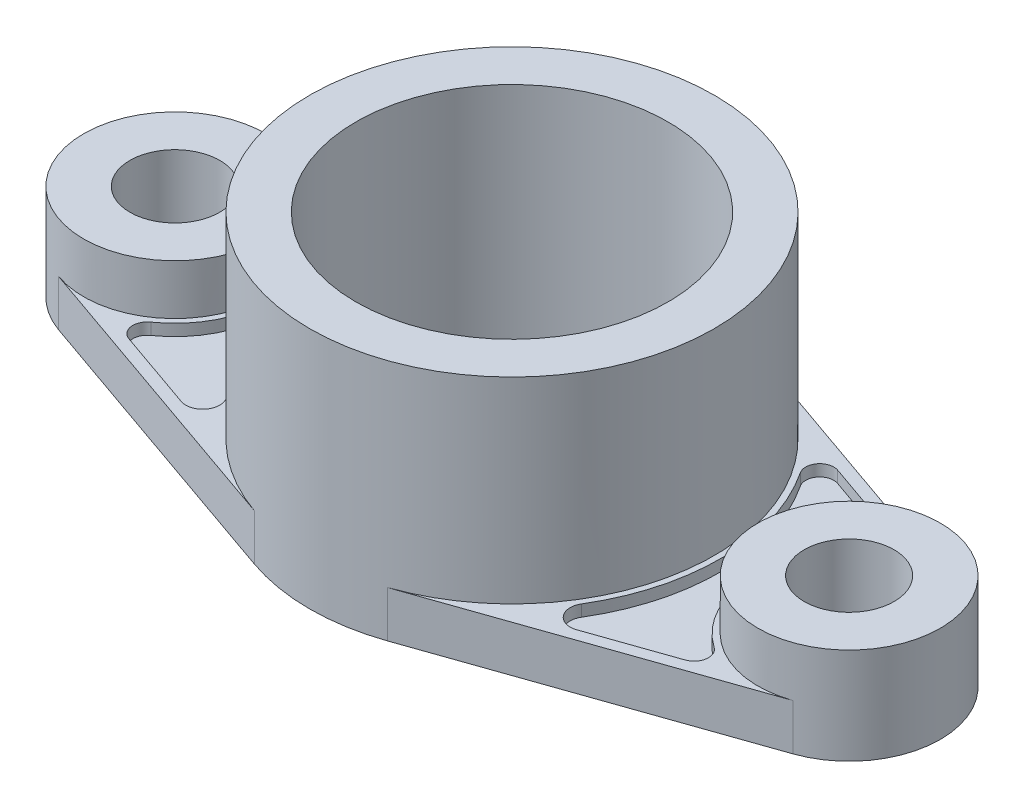
ISO-10303-21;
HEADER;
FILE_DESCRIPTION(('STEP AP214'),'2;1');
FILE_NAME('part.step','',(''),(''),'','','');
FILE_SCHEMA(('AUTOMOTIVE_DESIGN { 1 0 10303 214 1 1 1 1 }'));
ENDSEC;
DATA;
#1=APPLICATION_CONTEXT('core data for automotive mechanical design processes');
#2=APPLICATION_PROTOCOL_DEFINITION('international standard','automotive_design',2000,#1);
#3=PRODUCT_CONTEXT('',#1,'mechanical');
#4=PRODUCT('Part','Part','',(#3));
#5=PRODUCT_RELATED_PRODUCT_CATEGORY('part','',(#4));
#6=PRODUCT_DEFINITION_FORMATION('','',#4);
#7=PRODUCT_DEFINITION_CONTEXT('part definition',#1,'design');
#8=PRODUCT_DEFINITION('design','',#6,#7);
#9=PRODUCT_DEFINITION_SHAPE('','',#8);
#10=(LENGTH_UNIT() NAMED_UNIT(*) SI_UNIT(.MILLI.,.METRE.));
#11=(NAMED_UNIT(*) PLANE_ANGLE_UNIT() SI_UNIT($,.RADIAN.));
#12=(NAMED_UNIT(*) SI_UNIT($,.STERADIAN.) SOLID_ANGLE_UNIT());
#13=UNCERTAINTY_MEASURE_WITH_UNIT(LENGTH_MEASURE(1.E-05),#10,'distance_accuracy_value','');
#14=(GEOMETRIC_REPRESENTATION_CONTEXT(3) GLOBAL_UNCERTAINTY_ASSIGNED_CONTEXT((#13)) GLOBAL_UNIT_ASSIGNED_CONTEXT((#10,
#11,#12)) REPRESENTATION_CONTEXT('',''));
#15=CARTESIAN_POINT('',(0.,0.,0.));
#16=DIRECTION('',(0.,0.,1.));
#17=DIRECTION('',(1.,0.,0.));
#18=AXIS2_PLACEMENT_3D('',#15,#16,#17);
#19=CARTESIAN_POINT('',(0.,63.,0.));
#20=DIRECTION('',(0.,-1.,0.));
#21=DIRECTION('',(0.,0.,-1.));
#22=AXIS2_PLACEMENT_3D('',#19,#20,#21);
#23=CYLINDRICAL_SURFACE('',#22,52.5);
#24=CARTESIAN_POINT('',(0.,63.,0.));
#25=DIRECTION('',(0.,1.,0.));
#26=DIRECTION('',(0.,0.,1.));
#27=AXIS2_PLACEMENT_3D('',#24,#25,#26);
#28=CIRCLE('',#27,52.5);
#29=CARTESIAN_POINT('',(0.,63.,52.5));
#30=VERTEX_POINT('',#29);
#31=EDGE_CURVE('E275',#30,#30,#28,.T.);
#32=ORIENTED_EDGE('',*,*,#31,.F.);
#33=EDGE_LOOP('',(#32));
#34=FACE_BOUND('',#33,.T.);
#35=DIRECTION('',(0.,-1.,0.));
#36=VECTOR('',#35,1.);
#37=CARTESIAN_POINT('',(-17.301,12.,-49.56738241021));
#38=LINE('',#37,#36);
#39=CARTESIAN_POINT('',(-17.301,12.,-49.56738241021));
#40=VERTEX_POINT('',#39);
#41=CARTESIAN_POINT('',(-17.301,0.,-49.56738241021));
#42=VERTEX_POINT('',#41);
#43=EDGE_CURVE('E213',#40,#42,#38,.T.);
#44=ORIENTED_EDGE('',*,*,#43,.F.);
#45=CARTESIAN_POINT('',(0.,12.,0.));
#46=DIRECTION('',(0.,1.,0.));
#47=DIRECTION('',(0.,0.,1.));
#48=AXIS2_PLACEMENT_3D('',#45,#46,#47);
#49=CIRCLE('',#48,52.5);
#50=CARTESIAN_POINT('',(-17.301,12.,49.56738241021));
#51=VERTEX_POINT('',#50);
#52=EDGE_CURVE('E218',#40,#51,#49,.T.);
#53=ORIENTED_EDGE('',*,*,#52,.T.);
#54=DIRECTION('',(0.,-1.,0.));
#55=VECTOR('',#54,1.);
#56=CARTESIAN_POINT('',(-17.301,12.,49.56738241021));
#57=LINE('',#56,#55);
#58=CARTESIAN_POINT('',(-17.301,0.,49.56738241021));
#59=VERTEX_POINT('',#58);
#60=EDGE_CURVE('E241',#51,#59,#57,.T.);
#61=ORIENTED_EDGE('',*,*,#60,.T.);
#62=CARTESIAN_POINT('',(0.,0.,0.));
#63=DIRECTION('',(0.,1.,0.));
#64=DIRECTION('',(0.,0.,1.));
#65=AXIS2_PLACEMENT_3D('',#62,#63,#64);
#66=CIRCLE('',#65,52.5);
#67=CARTESIAN_POINT('',(17.301,0.,49.56738241021));
#68=VERTEX_POINT('',#67);
#69=EDGE_CURVE('E276',#59,#68,#66,.T.);
#70=ORIENTED_EDGE('',*,*,#69,.T.);
#71=DIRECTION('',(0.,-1.,0.));
#72=VECTOR('',#71,1.);
#73=CARTESIAN_POINT('',(17.301,12.,49.56738241021));
#74=LINE('',#73,#72);
#75=CARTESIAN_POINT('',(17.301,12.,49.56738241021));
#76=VERTEX_POINT('',#75);
#77=EDGE_CURVE('E340',#76,#68,#74,.T.);
#78=ORIENTED_EDGE('',*,*,#77,.F.);
#79=CARTESIAN_POINT('',(0.,12.,0.));
#80=DIRECTION('',(0.,1.,0.));
#81=DIRECTION('',(0.,0.,1.));
#82=AXIS2_PLACEMENT_3D('',#79,#80,#81);
#83=CIRCLE('',#82,52.5);
#84=CARTESIAN_POINT('',(17.301,12.,-49.5673824102101));
#85=VERTEX_POINT('',#84);
#86=EDGE_CURVE('E329',#76,#85,#83,.T.);
#87=ORIENTED_EDGE('',*,*,#86,.T.);
#88=DIRECTION('',(0.,-1.,0.));
#89=VECTOR('',#88,1.);
#90=CARTESIAN_POINT('',(17.301,12.,-49.56738241021));
#91=LINE('',#90,#89);
#92=CARTESIAN_POINT('',(17.301,0.,-49.56738241021));
#93=VERTEX_POINT('',#92);
#94=EDGE_CURVE('E341',#85,#93,#91,.T.);
#95=ORIENTED_EDGE('',*,*,#94,.T.);
#96=EDGE_CURVE('E272',#93,#42,#66,.T.);
#97=ORIENTED_EDGE('',*,*,#96,.T.);
#98=EDGE_LOOP('',(#44,#53,#61,#70,#78,#87,#95,#97));
#99=FACE_BOUND('',#98,.T.);
#100=ADVANCED_FACE('F41',(#34,#99),#23,.T.);
#101=CARTESIAN_POINT('',(17.301,12.,49.56738241021));
#102=DIRECTION('',(-0.329542857142857,0.,-0.944140617337334));
#103=DIRECTION('',(-0.944140617337334,0.,0.329542857142857));
#104=AXIS2_PLACEMENT_3D('',#101,#102,#103);
#105=PLANE('',#104);
#106=DIRECTION('',(0.944140617337334,0.,-0.329542857142857));
#107=VECTOR('',#106,1.);
#108=CARTESIAN_POINT('',(17.301,0.,49.56738241021));
#109=LINE('',#108,#107);
#110=CARTESIAN_POINT('',(95.2986317142857,0.,22.343087709288));
#111=VERTEX_POINT('',#110);
#112=EDGE_CURVE('E298',#68,#111,#109,.T.);
#113=ORIENTED_EDGE('',*,*,#112,.T.);
#114=DIRECTION('',(0.,-1.,0.));
#115=VECTOR('',#114,1.);
#116=CARTESIAN_POINT('',(95.2986317142857,12.,22.343087709288));
#117=LINE('',#116,#115);
#118=CARTESIAN_POINT('',(95.2986317142857,12.,22.343087709288));
#119=VERTEX_POINT('',#118);
#120=EDGE_CURVE('E11',#119,#111,#117,.T.);
#121=ORIENTED_EDGE('',*,*,#120,.F.);
#122=DIRECTION('',(0.944140617337334,0.,-0.329542857142857));
#123=VECTOR('',#122,1.);
#124=CARTESIAN_POINT('',(17.301,12.,49.56738241021));
#125=LINE('',#124,#123);
#126=EDGE_CURVE('E321',#76,#119,#125,.T.);
#127=ORIENTED_EDGE('',*,*,#126,.F.);
#128=ORIENTED_EDGE('',*,*,#77,.T.);
#129=EDGE_LOOP('',(#113,#121,#127,#128));
#130=FACE_BOUND('',#129,.T.);
#131=ADVANCED_FACE('F406',(#130),#105,.F.);
#132=CARTESIAN_POINT('',(17.301,12.,-49.56738241021));
#133=DIRECTION('',(0.329542857142857,0.,-0.944140617337334));
#134=DIRECTION('',(-0.944140617337334,0.,-0.329542857142857));
#135=AXIS2_PLACEMENT_3D('',#132,#133,#134);
#136=PLANE('',#135);
#137=DIRECTION('',(0.944140617337334,0.,0.329542857142858));
#138=VECTOR('',#137,1.);
#139=CARTESIAN_POINT('',(17.301,0.,-49.56738241021));
#140=LINE('',#139,#138);
#141=CARTESIAN_POINT('',(95.2986317142857,0.,-22.343087709288));
#142=VERTEX_POINT('',#141);
#143=EDGE_CURVE('E303',#93,#142,#140,.T.);
#144=ORIENTED_EDGE('',*,*,#143,.F.);
#145=ORIENTED_EDGE('',*,*,#94,.F.);
#146=DIRECTION('',(0.944140617337334,0.,0.329542857142858));
#147=VECTOR('',#146,1.);
#148=CARTESIAN_POINT('',(17.301,12.,-49.56738241021));
#149=LINE('',#148,#147);
#150=CARTESIAN_POINT('',(95.2986317142857,12.,-22.343087709288));
#151=VERTEX_POINT('',#150);
#152=EDGE_CURVE('E330',#85,#151,#149,.T.);
#153=ORIENTED_EDGE('',*,*,#152,.T.);
#154=DIRECTION('',(0.,-1.,0.));
#155=VECTOR('',#154,1.);
#156=CARTESIAN_POINT('',(95.2986317142857,12.,-22.343087709288));
#157=LINE('',#156,#155);
#158=EDGE_CURVE('E49',#151,#142,#157,.T.);
#159=ORIENTED_EDGE('',*,*,#158,.T.);
#160=EDGE_LOOP('',(#144,#145,#153,#159));
#161=FACE_BOUND('',#160,.T.);
#162=ADVANCED_FACE('F414',(#161),#136,.T.);
#163=CARTESIAN_POINT('',(0.,12.,0.));
#164=DIRECTION('',(0.,-1.,0.));
#165=DIRECTION('',(0.,0.,-1.));
#166=AXIS2_PLACEMENT_3D('',#163,#164,#165);
#167=CYLINDRICAL_SURFACE('',#166,54.);
#168=CARTESIAN_POINT('',(0.,9.,0.));
#169=DIRECTION('',(0.,1.,0.));
#170=DIRECTION('',(0.,0.,1.));
#171=AXIS2_PLACEMENT_3D('',#168,#169,#170);
#172=CIRCLE('',#171,54.);
#173=CARTESIAN_POINT('',(45.0507159156692,9.,-29.7730246277679));
#174=VERTEX_POINT('',#173);
#175=CARTESIAN_POINT('',(46.1221029185628,9.,28.0847222234706));
#176=VERTEX_POINT('',#175);
#177=EDGE_CURVE('E66',#174,#176,#172,.F.);
#178=ORIENTED_EDGE('',*,*,#177,.F.);
#179=DIRECTION('',(0.,-1.,0.));
#180=VECTOR('',#179,1.);
#181=CARTESIAN_POINT('',(45.0507159156692,12.,-29.7730246277679));
#182=LINE('',#181,#180);
#183=CARTESIAN_POINT('',(45.0507159156692,12.,-29.7730246277679));
#184=VERTEX_POINT('',#183);
#185=EDGE_CURVE('E44',#184,#174,#182,.T.);
#186=ORIENTED_EDGE('',*,*,#185,.F.);
#187=CARTESIAN_POINT('',(0.,12.,0.));
#188=DIRECTION('',(0.,1.,0.));
#189=DIRECTION('',(0.,0.,1.));
#190=AXIS2_PLACEMENT_3D('',#187,#188,#189);
#191=CIRCLE('',#190,54.);
#192=CARTESIAN_POINT('',(46.1221029185628,12.,28.0847222234706));
#193=VERTEX_POINT('',#192);
#194=EDGE_CURVE('E297',#184,#193,#191,.F.);
#195=ORIENTED_EDGE('',*,*,#194,.T.);
#196=DIRECTION('',(0.,-1.,0.));
#197=VECTOR('',#196,1.);
#198=CARTESIAN_POINT('',(46.1221029185628,12.,28.0847222234706));
#199=LINE('',#198,#197);
#200=EDGE_CURVE('E334',#193,#176,#199,.T.);
#201=ORIENTED_EDGE('',*,*,#200,.T.);
#202=EDGE_LOOP('',(#178,#186,#195,#201));
#203=FACE_BOUND('',#202,.T.);
#204=ADVANCED_FACE('F43',(#203),#167,.T.);
#205=CARTESIAN_POINT('',(48.0913614824408,12.,-31.7825202263121));
#206=DIRECTION('',(0.,-1.,0.));
#207=DIRECTION('',(0.,0.,-1.));
#208=AXIS2_PLACEMENT_3D('',#205,#206,#207);
#209=CYLINDRICAL_SURFACE('',#208,3.6446670661799);
#210=CARTESIAN_POINT('',(48.0913614824408,9.,-31.7825202263121));
#211=DIRECTION('',(0.,1.,0.));
#212=DIRECTION('',(0.,0.,1.));
#213=AXIS2_PLACEMENT_3D('',#210,#211,#212);
#214=CIRCLE('',#213,3.6446670661799);
#215=CARTESIAN_POINT('',(49.2924354807642,9.,-35.2235984401642));
#216=VERTEX_POINT('',#215);
#217=EDGE_CURVE('E277',#216,#174,#214,.T.);
#218=ORIENTED_EDGE('',*,*,#217,.F.);
#219=DIRECTION('',(0.,-1.,0.));
#220=VECTOR('',#219,1.);
#221=CARTESIAN_POINT('',(49.2924354807642,12.,-35.2235984401642));
#222=LINE('',#221,#220);
#223=CARTESIAN_POINT('',(49.2924354807642,12.,-35.2235984401642));
#224=VERTEX_POINT('',#223);
#225=EDGE_CURVE('E362',#224,#216,#222,.T.);
#226=ORIENTED_EDGE('',*,*,#225,.F.);
#227=CARTESIAN_POINT('',(48.0913614824408,12.,-31.7825202263121));
#228=DIRECTION('',(0.,1.,0.));
#229=DIRECTION('',(0.,0.,1.));
#230=AXIS2_PLACEMENT_3D('',#227,#228,#229);
#231=CIRCLE('',#230,3.6446670661799);
#232=EDGE_CURVE('E302',#224,#184,#231,.T.);
#233=ORIENTED_EDGE('',*,*,#232,.T.);
#234=ORIENTED_EDGE('',*,*,#185,.T.);
#235=EDGE_LOOP('',(#218,#226,#233,#234));
#236=FACE_BOUND('',#235,.T.);
#237=ADVANCED_FACE('F369',(#236),#209,.F.);
#238=CARTESIAN_POINT('',(16.3123714285715,12.,-46.734960558198));
#239=DIRECTION('',(0.329542857142858,0.,-0.944140617337334));
#240=DIRECTION('',(-0.944140617337334,0.,-0.329542857142858));
#241=AXIS2_PLACEMENT_3D('',#238,#239,#240);
#242=PLANE('',#241);
#243=ORIENTED_EDGE('',*,*,#225,.T.);
#244=DIRECTION('',(0.944140617337334,0.,0.329542857142858));
#245=VECTOR('',#244,1.);
#246=CARTESIAN_POINT('',(16.3123714285715,9.,-46.734960558198));
#247=LINE('',#246,#245);
#248=CARTESIAN_POINT('',(73.0615652441253,9.,-26.9272209830564));
#249=VERTEX_POINT('',#248);
#250=EDGE_CURVE('E299',#216,#249,#247,.T.);
#251=ORIENTED_EDGE('',*,*,#250,.T.);
#252=DIRECTION('',(0.,-1.,0.));
#253=VECTOR('',#252,1.);
#254=CARTESIAN_POINT('',(73.0615652441253,12.,-26.9272209830564));
#255=LINE('',#254,#253);
#256=CARTESIAN_POINT('',(73.0615652441253,12.,-26.9272209830564));
#257=VERTEX_POINT('',#256);
#258=EDGE_CURVE('E359',#257,#249,#255,.T.);
#259=ORIENTED_EDGE('',*,*,#258,.F.);
#260=DIRECTION('',(0.944140617337334,0.,0.329542857142858));
#261=VECTOR('',#260,1.);
#262=CARTESIAN_POINT('',(16.3123714285715,12.,-46.734960558198));
#263=LINE('',#262,#261);
#264=EDGE_CURVE('E307',#224,#257,#263,.T.);
#265=ORIENTED_EDGE('',*,*,#264,.F.);
#266=EDGE_LOOP('',(#243,#251,#259,#265));
#267=FACE_BOUND('',#266,.T.);
#268=ADVANCED_FACE('F397',(#267),#242,.F.);
#269=CARTESIAN_POINT('',(71.9820251135155,12.,-23.8343374225046));
#270=DIRECTION('',(0.,-1.,0.));
#271=DIRECTION('',(0.,0.,-1.));
#272=AXIS2_PLACEMENT_3D('',#269,#270,#271);
#273=CYLINDRICAL_SURFACE('',#272,3.27587173325332);
#274=ORIENTED_EDGE('',*,*,#258,.T.);
#275=CARTESIAN_POINT('',(71.9820251135155,9.,-23.8343374225046));
#276=DIRECTION('',(0.,1.,0.));
#277=DIRECTION('',(0.,0.,1.));
#278=AXIS2_PLACEMENT_3D('',#275,#276,#277);
#279=CIRCLE('',#278,3.27587173325332);
#280=CARTESIAN_POINT('',(73.7694139026057,9.,-21.0890547541146));
#281=VERTEX_POINT('',#280);
#282=EDGE_CURVE('E291',#249,#281,#279,.F.);
#283=ORIENTED_EDGE('',*,*,#282,.T.);
#284=DIRECTION('',(0.,-1.,0.));
#285=VECTOR('',#284,1.);
#286=CARTESIAN_POINT('',(73.7694139026057,12.,-21.0890547541146));
#287=LINE('',#286,#285);
#288=CARTESIAN_POINT('',(73.7694139026057,12.,-21.0890547541146));
#289=VERTEX_POINT('',#288);
#290=EDGE_CURVE('E360',#289,#281,#287,.T.);
#291=ORIENTED_EDGE('',*,*,#290,.F.);
#292=CARTESIAN_POINT('',(71.9820251135155,12.,-23.8343374225046));
#293=DIRECTION('',(0.,1.,0.));
#294=DIRECTION('',(0.,0.,1.));
#295=AXIS2_PLACEMENT_3D('',#292,#293,#294);
#296=CIRCLE('',#295,3.27587173325332);
#297=EDGE_CURVE('E310',#257,#289,#296,.F.);
#298=ORIENTED_EDGE('',*,*,#297,.F.);
#299=EDGE_LOOP('',(#274,#283,#291,#298));
#300=FACE_BOUND('',#299,.T.);
#301=ADVANCED_FACE('F396',(#300),#273,.F.);
#302=CARTESIAN_POINT('',(87.5,12.,0.));
#303=DIRECTION('',(0.,-1.,0.));
#304=DIRECTION('',(0.,0.,-1.));
#305=AXIS2_PLACEMENT_3D('',#302,#303,#304);
#306=CYLINDRICAL_SURFACE('',#305,25.165);
#307=CARTESIAN_POINT('',(87.5,9.,0.));
#308=DIRECTION('',(0.,1.,0.));
#309=DIRECTION('',(0.,0.,1.));
#310=AXIS2_PLACEMENT_3D('',#307,#308,#309);
#311=CIRCLE('',#310,25.165);
#312=CARTESIAN_POINT('',(73.1027290750617,9.,20.6396660562599));
#313=VERTEX_POINT('',#312);
#314=EDGE_CURVE('E292',#313,#281,#311,.F.);
#315=ORIENTED_EDGE('',*,*,#314,.F.);
#316=DIRECTION('',(0.,-1.,0.));
#317=VECTOR('',#316,1.);
#318=CARTESIAN_POINT('',(73.1027290750617,12.,20.6396660562599));
#319=LINE('',#318,#317);
#320=CARTESIAN_POINT('',(73.1027290750617,12.,20.6396660562599));
#321=VERTEX_POINT('',#320);
#322=EDGE_CURVE('E353',#321,#313,#319,.T.);
#323=ORIENTED_EDGE('',*,*,#322,.F.);
#324=CARTESIAN_POINT('',(87.5,12.,0.));
#325=DIRECTION('',(0.,1.,0.));
#326=DIRECTION('',(0.,0.,1.));
#327=AXIS2_PLACEMENT_3D('',#324,#325,#326);
#328=CIRCLE('',#327,25.165);
#329=EDGE_CURVE('E313',#321,#289,#328,.F.);
#330=ORIENTED_EDGE('',*,*,#329,.T.);
#331=ORIENTED_EDGE('',*,*,#290,.T.);
#332=EDGE_LOOP('',(#315,#323,#330,#331));
#333=FACE_BOUND('',#332,.T.);
#334=ADVANCED_FACE('F394',(#333),#306,.T.);
#335=CARTESIAN_POINT('',(70.9659800044808,12.,23.7028707075262));
#336=DIRECTION('',(0.,-1.,0.));
#337=DIRECTION('',(0.,0.,-1.));
#338=AXIS2_PLACEMENT_3D('',#335,#336,#337);
#339=CYLINDRICAL_SURFACE('',#338,3.73482520690969);
#340=CARTESIAN_POINT('',(70.9659800044808,9.,23.7028707075262));
#341=DIRECTION('',(0.,1.,0.));
#342=DIRECTION('',(0.,0.,1.));
#343=AXIS2_PLACEMENT_3D('',#340,#341,#342);
#344=CIRCLE('',#343,3.73482520690969);
#345=CARTESIAN_POINT('',(72.196764974095,9.,27.229070884025));
#346=VERTEX_POINT('',#345);
#347=EDGE_CURVE('E288',#346,#313,#344,.T.);
#348=ORIENTED_EDGE('',*,*,#347,.F.);
#349=DIRECTION('',(0.,-1.,0.));
#350=VECTOR('',#349,1.);
#351=CARTESIAN_POINT('',(72.196764974095,12.,27.229070884025));
#352=LINE('',#351,#350);
#353=CARTESIAN_POINT('',(72.196764974095,12.,27.229070884025));
#354=VERTEX_POINT('',#353);
#355=EDGE_CURVE('E354',#354,#346,#352,.T.);
#356=ORIENTED_EDGE('',*,*,#355,.F.);
#357=CARTESIAN_POINT('',(70.9659800044808,12.,23.7028707075262));
#358=DIRECTION('',(0.,1.,0.));
#359=DIRECTION('',(0.,0.,1.));
#360=AXIS2_PLACEMENT_3D('',#357,#358,#359);
#361=CIRCLE('',#360,3.73482520690969);
#362=EDGE_CURVE('E314',#354,#321,#361,.T.);
#363=ORIENTED_EDGE('',*,*,#362,.T.);
#364=ORIENTED_EDGE('',*,*,#322,.T.);
#365=EDGE_LOOP('',(#348,#356,#363,#364));
#366=FACE_BOUND('',#365,.T.);
#367=ADVANCED_FACE('F389',(#366),#339,.F.);
#368=CARTESIAN_POINT('',(16.3123714285714,12.,46.734960558198));
#369=DIRECTION('',(0.329542857142857,0.,0.944140617337334));
#370=DIRECTION('',(0.944140617337334,0.,-0.329542857142857));
#371=AXIS2_PLACEMENT_3D('',#368,#369,#370);
#372=PLANE('',#371);
#373=ORIENTED_EDGE('',*,*,#355,.T.);
#374=DIRECTION('',(-0.944140617337334,0.,0.329542857142857));
#375=VECTOR('',#374,1.);
#376=CARTESIAN_POINT('',(16.3123714285714,9.,46.734960558198));
#377=LINE('',#376,#375);
#378=CARTESIAN_POINT('',(51.3207411159862,9.,34.5156386067285));
#379=VERTEX_POINT('',#378);
#380=EDGE_CURVE('E286',#346,#379,#377,.T.);
#381=ORIENTED_EDGE('',*,*,#380,.T.);
#382=DIRECTION('',(0.,-1.,0.));
#383=VECTOR('',#382,1.);
#384=CARTESIAN_POINT('',(51.3207411159862,12.,34.5156386067285));
#385=LINE('',#384,#383);
#386=CARTESIAN_POINT('',(51.3207411159862,12.,34.5156386067285));
#387=VERTEX_POINT('',#386);
#388=EDGE_CURVE('E346',#387,#379,#385,.T.);
#389=ORIENTED_EDGE('',*,*,#388,.F.);
#390=DIRECTION('',(-0.944140617337334,0.,0.329542857142857));
#391=VECTOR('',#390,1.);
#392=CARTESIAN_POINT('',(16.3123714285714,12.,46.734960558198));
#393=LINE('',#392,#391);
#394=EDGE_CURVE('E320',#354,#387,#393,.T.);
#395=ORIENTED_EDGE('',*,*,#394,.F.);
#396=EDGE_LOOP('',(#373,#381,#389,#395));
#397=FACE_BOUND('',#396,.T.);
#398=ADVANCED_FACE('F387',(#397),#372,.F.);
#399=CARTESIAN_POINT('',(49.8733828742537,12.,30.3689557876702));
#400=DIRECTION('',(0.,-1.,0.));
#401=DIRECTION('',(0.,0.,-1.));
#402=AXIS2_PLACEMENT_3D('',#399,#400,#401);
#403=CYLINDRICAL_SURFACE('',#402,4.39201824697762);
#404=ORIENTED_EDGE('',*,*,#388,.T.);
#405=CARTESIAN_POINT('',(49.8733828742537,9.,30.3689557876702));
#406=DIRECTION('',(0.,1.,0.));
#407=DIRECTION('',(0.,0.,1.));
#408=AXIS2_PLACEMENT_3D('',#405,#406,#407);
#409=CIRCLE('',#408,4.39201824697762);
#410=EDGE_CURVE('E283',#379,#176,#409,.F.);
#411=ORIENTED_EDGE('',*,*,#410,.T.);
#412=ORIENTED_EDGE('',*,*,#200,.F.);
#413=CARTESIAN_POINT('',(49.8733828742537,12.,30.3689557876702));
#414=DIRECTION('',(0.,1.,0.));
#415=DIRECTION('',(0.,0.,1.));
#416=AXIS2_PLACEMENT_3D('',#413,#414,#415);
#417=CIRCLE('',#416,4.39201824697762);
#418=EDGE_CURVE('E317',#387,#193,#417,.F.);
#419=ORIENTED_EDGE('',*,*,#418,.F.);
#420=EDGE_LOOP('',(#404,#411,#412,#419));
#421=FACE_BOUND('',#420,.T.);
#422=ADVANCED_FACE('F385',(#421),#403,.F.);
#423=CARTESIAN_POINT('',(0.,12.,0.));
#424=DIRECTION('',(0.,1.,0.));
#425=DIRECTION('',(0.,0.,1.));
#426=AXIS2_PLACEMENT_3D('',#423,#424,#425);
#427=PLANE('',#426);
#428=ORIENTED_EDGE('',*,*,#194,.F.);
#429=ORIENTED_EDGE('',*,*,#232,.F.);
#430=ORIENTED_EDGE('',*,*,#264,.T.);
#431=ORIENTED_EDGE('',*,*,#297,.T.);
#432=ORIENTED_EDGE('',*,*,#329,.F.);
#433=ORIENTED_EDGE('',*,*,#362,.F.);
#434=ORIENTED_EDGE('',*,*,#394,.T.);
#435=ORIENTED_EDGE('',*,*,#418,.T.);
#436=EDGE_LOOP('',(#428,#429,#430,#431,#432,#433,#434,#435));
#437=FACE_BOUND('',#436,.T.);
#438=ORIENTED_EDGE('',*,*,#126,.T.);
#439=CARTESIAN_POINT('',(87.5,12.,0.));
#440=DIRECTION('',(0.,1.,0.));
#441=DIRECTION('',(0.,0.,1.));
#442=AXIS2_PLACEMENT_3D('',#439,#440,#441);
#443=CIRCLE('',#442,23.665);
#444=EDGE_CURVE('E322',#119,#151,#443,.F.);
#445=ORIENTED_EDGE('',*,*,#444,.T.);
#446=ORIENTED_EDGE('',*,*,#152,.F.);
#447=ORIENTED_EDGE('',*,*,#86,.F.);
#448=EDGE_LOOP('',(#438,#445,#446,#447));
#449=FACE_BOUND('',#448,.T.);
#450=ADVANCED_FACE('F372',(#437,#449),#427,.T.);
#451=CARTESIAN_POINT('',(0.,0.,0.));
#452=DIRECTION('',(0.,1.,0.));
#453=DIRECTION('',(0.,0.,1.));
#454=AXIS2_PLACEMENT_3D('',#451,#452,#453);
#455=PLANE('',#454);
#456=ORIENTED_EDGE('',*,*,#112,.F.);
#457=ORIENTED_EDGE('',*,*,#69,.F.);
#458=DIRECTION('',(-0.944140617337334,0.,-0.329542857142857));
#459=VECTOR('',#458,1.);
#460=CARTESIAN_POINT('',(-17.301,0.,49.56738241021));
#461=LINE('',#460,#459);
#462=CARTESIAN_POINT('',(-95.2986317142857,0.,22.343087709288));
#463=VERTEX_POINT('',#462);
#464=EDGE_CURVE('E234',#59,#463,#461,.T.);
#465=ORIENTED_EDGE('',*,*,#464,.T.);
#466=CARTESIAN_POINT('',(-87.5,0.,0.));
#467=DIRECTION('',(0.,1.,0.));
#468=DIRECTION('',(0.,0.,1.));
#469=AXIS2_PLACEMENT_3D('',#466,#467,#468);
#470=CIRCLE('',#469,23.665);
#471=CARTESIAN_POINT('',(-95.2986317142857,0.,-22.343087709288));
#472=VERTEX_POINT('',#471);
#473=EDGE_CURVE('E741',#472,#463,#470,.T.);
#474=ORIENTED_EDGE('',*,*,#473,.F.);
#475=DIRECTION('',(-0.944140617337334,0.,0.329542857142858));
#476=VECTOR('',#475,1.);
#477=CARTESIAN_POINT('',(-17.301,0.,-49.56738241021));
#478=LINE('',#477,#476);
#479=EDGE_CURVE('E208',#42,#472,#478,.T.);
#480=ORIENTED_EDGE('',*,*,#479,.F.);
#481=ORIENTED_EDGE('',*,*,#96,.F.);
#482=ORIENTED_EDGE('',*,*,#143,.T.);
#483=CARTESIAN_POINT('',(87.5,0.,0.));
#484=DIRECTION('',(0.,1.,0.));
#485=DIRECTION('',(0.,0.,1.));
#486=AXIS2_PLACEMENT_3D('',#483,#484,#485);
#487=CIRCLE('',#486,23.665);
#488=EDGE_CURVE('E747',#142,#111,#487,.F.);
#489=ORIENTED_EDGE('',*,*,#488,.T.);
#490=EDGE_LOOP('',(#456,#457,#465,#474,#480,#481,#482,#489));
#491=FACE_BOUND('',#490,.T.);
#492=CARTESIAN_POINT('',(0.,0.,0.));
#493=DIRECTION('',(0.,1.,0.));
#494=DIRECTION('',(0.,0.,1.));
#495=AXIS2_PLACEMENT_3D('',#492,#493,#494);
#496=CIRCLE('',#495,40.5);
#497=CARTESIAN_POINT('',(0.,0.,40.5));
#498=VERTEX_POINT('',#497);
#499=EDGE_CURVE('E246',#498,#498,#496,.T.);
#500=ORIENTED_EDGE('',*,*,#499,.T.);
#501=EDGE_LOOP('',(#500));
#502=FACE_BOUND('',#501,.T.);
#503=CARTESIAN_POINT('',(-87.5,0.,0.));
#504=DIRECTION('',(0.,1.,0.));
#505=DIRECTION('',(0.,0.,1.));
#506=AXIS2_PLACEMENT_3D('',#503,#504,#505);
#507=CIRCLE('',#506,11.665);
#508=CARTESIAN_POINT('',(-87.5,0.,11.665));
#509=VERTEX_POINT('',#508);
#510=EDGE_CURVE('E740',#509,#509,#507,.T.);
#511=ORIENTED_EDGE('',*,*,#510,.T.);
#512=EDGE_LOOP('',(#511));
#513=FACE_BOUND('',#512,.T.);
#514=CARTESIAN_POINT('',(87.5,0.,0.));
#515=DIRECTION('',(0.,1.,0.));
#516=DIRECTION('',(0.,0.,1.));
#517=AXIS2_PLACEMENT_3D('',#514,#515,#516);
#518=CIRCLE('',#517,11.665);
#519=CARTESIAN_POINT('',(87.5,0.,11.665));
#520=VERTEX_POINT('',#519);
#521=EDGE_CURVE('E742',#520,#520,#518,.F.);
#522=ORIENTED_EDGE('',*,*,#521,.F.);
#523=EDGE_LOOP('',(#522));
#524=FACE_BOUND('',#523,.T.);
#525=ADVANCED_FACE('F428',(#491,#502,#513,#524),#455,.F.);
#526=CARTESIAN_POINT('',(0.,9.,0.));
#527=DIRECTION('',(0.,1.,0.));
#528=DIRECTION('',(0.,0.,1.));
#529=AXIS2_PLACEMENT_3D('',#526,#527,#528);
#530=PLANE('',#529);
#531=ORIENTED_EDGE('',*,*,#217,.T.);
#532=ORIENTED_EDGE('',*,*,#177,.T.);
#533=ORIENTED_EDGE('',*,*,#410,.F.);
#534=ORIENTED_EDGE('',*,*,#380,.F.);
#535=ORIENTED_EDGE('',*,*,#347,.T.);
#536=ORIENTED_EDGE('',*,*,#314,.T.);
#537=ORIENTED_EDGE('',*,*,#282,.F.);
#538=ORIENTED_EDGE('',*,*,#250,.F.);
#539=EDGE_LOOP('',(#531,#532,#533,#534,#535,#536,#537,#538));
#540=FACE_BOUND('',#539,.T.);
#541=ADVANCED_FACE('F382',(#540),#530,.T.);
#542=CARTESIAN_POINT('',(0.,63.,0.));
#543=DIRECTION('',(0.,-1.,0.));
#544=DIRECTION('',(0.,0.,-1.));
#545=AXIS2_PLACEMENT_3D('',#542,#543,#544);
#546=CYLINDRICAL_SURFACE('',#545,40.5);
#547=CARTESIAN_POINT('',(0.,63.,0.));
#548=DIRECTION('',(0.,1.,0.));
#549=DIRECTION('',(0.,0.,1.));
#550=AXIS2_PLACEMENT_3D('',#547,#548,#549);
#551=CIRCLE('',#550,40.5);
#552=CARTESIAN_POINT('',(0.,63.,40.5));
#553=VERTEX_POINT('',#552);
#554=EDGE_CURVE('E267',#553,#553,#551,.T.);
#555=ORIENTED_EDGE('',*,*,#554,.T.);
#556=EDGE_LOOP('',(#555));
#557=FACE_BOUND('',#556,.T.);
#558=ORIENTED_EDGE('',*,*,#499,.F.);
#559=EDGE_LOOP('',(#558));
#560=FACE_BOUND('',#559,.T.);
#561=ADVANCED_FACE('F424',(#557,#560),#546,.F.);
#562=CARTESIAN_POINT('',(0.,63.,0.));
#563=DIRECTION('',(0.,1.,0.));
#564=DIRECTION('',(0.,0.,1.));
#565=AXIS2_PLACEMENT_3D('',#562,#563,#564);
#566=PLANE('',#565);
#567=ORIENTED_EDGE('',*,*,#554,.F.);
#568=EDGE_LOOP('',(#567));
#569=FACE_BOUND('',#568,.T.);
#570=ORIENTED_EDGE('',*,*,#31,.T.);
#571=EDGE_LOOP('',(#570));
#572=FACE_BOUND('',#571,.T.);
#573=ADVANCED_FACE('F425',(#569,#572),#566,.T.);
#574=CARTESIAN_POINT('',(-17.301,12.,49.56738241021));
#575=DIRECTION('',(-0.329542857142857,0.,0.944140617337334));
#576=DIRECTION('',(0.944140617337334,0.,0.329542857142857));
#577=AXIS2_PLACEMENT_3D('',#574,#575,#576);
#578=PLANE('',#577);
#579=ORIENTED_EDGE('',*,*,#464,.F.);
#580=ORIENTED_EDGE('',*,*,#60,.F.);
#581=DIRECTION('',(-0.944140617337334,0.,-0.329542857142857));
#582=VECTOR('',#581,1.);
#583=CARTESIAN_POINT('',(-17.301,12.,49.56738241021));
#584=LINE('',#583,#582);
#585=CARTESIAN_POINT('',(-95.2986317142857,12.,22.343087709288));
#586=VERTEX_POINT('',#585);
#587=EDGE_CURVE('E59',#51,#586,#584,.T.);
#588=ORIENTED_EDGE('',*,*,#587,.T.);
#589=DIRECTION('',(0.,-1.,0.));
#590=VECTOR('',#589,1.);
#591=CARTESIAN_POINT('',(-95.2986317142857,12.,22.343087709288));
#592=LINE('',#591,#590);
#593=EDGE_CURVE('E229',#586,#463,#592,.T.);
#594=ORIENTED_EDGE('',*,*,#593,.T.);
#595=EDGE_LOOP('',(#579,#580,#588,#594));
#596=FACE_BOUND('',#595,.T.);
#597=ADVANCED_FACE('F481',(#596),#578,.T.);
#598=CARTESIAN_POINT('',(-49.8733828742537,12.,30.3689557876702));
#599=DIRECTION('',(0.,-1.,0.));
#600=DIRECTION('',(0.,0.,-1.));
#601=AXIS2_PLACEMENT_3D('',#598,#599,#600);
#602=CYLINDRICAL_SURFACE('',#601,4.39201824697762);
#603=CARTESIAN_POINT('',(-49.8733828742537,9.,30.3689557876702));
#604=DIRECTION('',(0.,1.,0.));
#605=DIRECTION('',(0.,0.,1.));
#606=AXIS2_PLACEMENT_3D('',#603,#604,#605);
#607=CIRCLE('',#606,4.39201824697762);
#608=CARTESIAN_POINT('',(-51.3207411159862,9.,34.5156386067285));
#609=VERTEX_POINT('',#608);
#610=CARTESIAN_POINT('',(-46.1221029185628,9.,28.0847222234706));
#611=VERTEX_POINT('',#610);
#612=EDGE_CURVE('E754',#609,#611,#607,.T.);
#613=ORIENTED_EDGE('',*,*,#612,.F.);
#614=DIRECTION('',(0.,-1.,0.));
#615=VECTOR('',#614,1.);
#616=CARTESIAN_POINT('',(-51.3207411159862,12.,34.5156386067285));
#617=LINE('',#616,#615);
#618=CARTESIAN_POINT('',(-51.3207411159862,12.,34.5156386067285));
#619=VERTEX_POINT('',#618);
#620=EDGE_CURVE('E212',#619,#609,#617,.T.);
#621=ORIENTED_EDGE('',*,*,#620,.F.);
#622=CARTESIAN_POINT('',(-49.8733828742537,12.,30.3689557876702));
#623=DIRECTION('',(0.,1.,0.));
#624=DIRECTION('',(0.,0.,1.));
#625=AXIS2_PLACEMENT_3D('',#622,#623,#624);
#626=CIRCLE('',#625,4.39201824697762);
#627=CARTESIAN_POINT('',(-46.1221029185628,12.,28.0847222234706));
#628=VERTEX_POINT('',#627);
#629=EDGE_CURVE('E239',#619,#628,#626,.T.);
#630=ORIENTED_EDGE('',*,*,#629,.T.);
#631=DIRECTION('',(0.,-1.,0.));
#632=VECTOR('',#631,1.);
#633=CARTESIAN_POINT('',(-46.1221029185628,12.,28.0847222234706));
#634=LINE('',#633,#632);
#635=EDGE_CURVE('E222',#628,#611,#634,.T.);
#636=ORIENTED_EDGE('',*,*,#635,.T.);
#637=EDGE_LOOP('',(#613,#621,#630,#636));
#638=FACE_BOUND('',#637,.T.);
#639=ADVANCED_FACE('F486',(#638),#602,.F.);
#640=CARTESIAN_POINT('',(-16.3123714285714,12.,46.734960558198));
#641=DIRECTION('',(0.329542857142857,0.,-0.944140617337334));
#642=DIRECTION('',(-0.944140617337334,0.,-0.329542857142857));
#643=AXIS2_PLACEMENT_3D('',#640,#641,#642);
#644=PLANE('',#643);
#645=DIRECTION('',(0.944140617337334,0.,0.329542857142857));
#646=VECTOR('',#645,1.);
#647=CARTESIAN_POINT('',(-16.3123714285714,9.,46.734960558198));
#648=LINE('',#647,#646);
#649=CARTESIAN_POINT('',(-72.196764974095,9.,27.229070884025));
#650=VERTEX_POINT('',#649);
#651=EDGE_CURVE('E755',#650,#609,#648,.T.);
#652=ORIENTED_EDGE('',*,*,#651,.F.);
#653=DIRECTION('',(0.,-1.,0.));
#654=VECTOR('',#653,1.);
#655=CARTESIAN_POINT('',(-72.196764974095,12.,27.229070884025));
#656=LINE('',#655,#654);
#657=CARTESIAN_POINT('',(-72.196764974095,12.,27.229070884025));
#658=VERTEX_POINT('',#657);
#659=EDGE_CURVE('E262',#658,#650,#656,.T.);
#660=ORIENTED_EDGE('',*,*,#659,.F.);
#661=DIRECTION('',(0.944140617337334,0.,0.329542857142857));
#662=VECTOR('',#661,1.);
#663=CARTESIAN_POINT('',(-16.3123714285714,12.,46.734960558198));
#664=LINE('',#663,#662);
#665=EDGE_CURVE('E771',#658,#619,#664,.T.);
#666=ORIENTED_EDGE('',*,*,#665,.T.);
#667=ORIENTED_EDGE('',*,*,#620,.T.);
#668=EDGE_LOOP('',(#652,#660,#666,#667));
#669=FACE_BOUND('',#668,.T.);
#670=ADVANCED_FACE('F494',(#669),#644,.T.);
#671=CARTESIAN_POINT('',(-70.9659800044808,12.,23.7028707075262));
#672=DIRECTION('',(0.,-1.,0.));
#673=DIRECTION('',(0.,0.,-1.));
#674=AXIS2_PLACEMENT_3D('',#671,#672,#673);
#675=CYLINDRICAL_SURFACE('',#674,3.73482520690969);
#676=ORIENTED_EDGE('',*,*,#659,.T.);
#677=CARTESIAN_POINT('',(-70.9659800044808,9.,23.7028707075262));
#678=DIRECTION('',(0.,1.,0.));
#679=DIRECTION('',(0.,0.,1.));
#680=AXIS2_PLACEMENT_3D('',#677,#678,#679);
#681=CIRCLE('',#680,3.73482520690969);
#682=CARTESIAN_POINT('',(-73.1027290750617,9.,20.6396660562599));
#683=VERTEX_POINT('',#682);
#684=EDGE_CURVE('E236',#650,#683,#681,.F.);
#685=ORIENTED_EDGE('',*,*,#684,.T.);
#686=DIRECTION('',(0.,-1.,0.));
#687=VECTOR('',#686,1.);
#688=CARTESIAN_POINT('',(-73.1027290750617,12.,20.6396660562599));
#689=LINE('',#688,#687);
#690=CARTESIAN_POINT('',(-73.1027290750617,12.,20.6396660562599));
#691=VERTEX_POINT('',#690);
#692=EDGE_CURVE('E261',#691,#683,#689,.T.);
#693=ORIENTED_EDGE('',*,*,#692,.F.);
#694=CARTESIAN_POINT('',(-70.9659800044808,12.,23.7028707075262));
#695=DIRECTION('',(0.,1.,0.));
#696=DIRECTION('',(0.,0.,1.));
#697=AXIS2_PLACEMENT_3D('',#694,#695,#696);
#698=CIRCLE('',#697,3.73482520690969);
#699=EDGE_CURVE('E776',#658,#691,#698,.F.);
#700=ORIENTED_EDGE('',*,*,#699,.F.);
#701=EDGE_LOOP('',(#676,#685,#693,#700));
#702=FACE_BOUND('',#701,.T.);
#703=ADVANCED_FACE('F505',(#702),#675,.F.);
#704=CARTESIAN_POINT('',(-87.5,12.,0.));
#705=DIRECTION('',(0.,-1.,0.));
#706=DIRECTION('',(0.,0.,-1.));
#707=AXIS2_PLACEMENT_3D('',#704,#705,#706);
#708=CYLINDRICAL_SURFACE('',#707,25.165);
#709=ORIENTED_EDGE('',*,*,#692,.T.);
#710=CARTESIAN_POINT('',(-87.5,9.,0.));
#711=DIRECTION('',(0.,1.,0.));
#712=DIRECTION('',(0.,0.,1.));
#713=AXIS2_PLACEMENT_3D('',#710,#711,#712);
#714=CIRCLE('',#713,25.165);
#715=CARTESIAN_POINT('',(-73.7694139026057,9.,-21.0890547541146));
#716=VERTEX_POINT('',#715);
#717=EDGE_CURVE('E770',#683,#716,#714,.T.);
#718=ORIENTED_EDGE('',*,*,#717,.T.);
#719=DIRECTION('',(0.,-1.,0.));
#720=VECTOR('',#719,1.);
#721=CARTESIAN_POINT('',(-73.7694139026057,12.,-21.0890547541146));
#722=LINE('',#721,#720);
#723=CARTESIAN_POINT('',(-73.7694139026057,12.,-21.0890547541146));
#724=VERTEX_POINT('',#723);
#725=EDGE_CURVE('E256',#724,#716,#722,.T.);
#726=ORIENTED_EDGE('',*,*,#725,.F.);
#727=CARTESIAN_POINT('',(-87.5,12.,0.));
#728=DIRECTION('',(0.,1.,0.));
#729=DIRECTION('',(0.,0.,1.));
#730=AXIS2_PLACEMENT_3D('',#727,#728,#729);
#731=CIRCLE('',#730,25.165);
#732=EDGE_CURVE('E778',#691,#724,#731,.T.);
#733=ORIENTED_EDGE('',*,*,#732,.F.);
#734=EDGE_LOOP('',(#709,#718,#726,#733));
#735=FACE_BOUND('',#734,.T.);
#736=ADVANCED_FACE('F515',(#735),#708,.T.);
#737=CARTESIAN_POINT('',(-71.9820251135155,12.,-23.8343374225046));
#738=DIRECTION('',(0.,-1.,0.));
#739=DIRECTION('',(0.,0.,-1.));
#740=AXIS2_PLACEMENT_3D('',#737,#738,#739);
#741=CYLINDRICAL_SURFACE('',#740,3.27587173325332);
#742=CARTESIAN_POINT('',(-71.9820251135155,9.,-23.8343374225046));
#743=DIRECTION('',(0.,1.,0.));
#744=DIRECTION('',(0.,0.,1.));
#745=AXIS2_PLACEMENT_3D('',#742,#743,#744);
#746=CIRCLE('',#745,3.27587173325332);
#747=CARTESIAN_POINT('',(-73.0615652441253,9.,-26.9272209830564));
#748=VERTEX_POINT('',#747);
#749=EDGE_CURVE('E764',#748,#716,#746,.T.);
#750=ORIENTED_EDGE('',*,*,#749,.F.);
#751=DIRECTION('',(0.,-1.,0.));
#752=VECTOR('',#751,1.);
#753=CARTESIAN_POINT('',(-73.0615652441253,12.,-26.9272209830564));
#754=LINE('',#753,#752);
#755=CARTESIAN_POINT('',(-73.0615652441253,12.,-26.9272209830564));
#756=VERTEX_POINT('',#755);
#757=EDGE_CURVE('E254',#756,#748,#754,.T.);
#758=ORIENTED_EDGE('',*,*,#757,.F.);
#759=CARTESIAN_POINT('',(-71.9820251135155,12.,-23.8343374225046));
#760=DIRECTION('',(0.,1.,0.));
#761=DIRECTION('',(0.,0.,1.));
#762=AXIS2_PLACEMENT_3D('',#759,#760,#761);
#763=CIRCLE('',#762,3.27587173325332);
#764=EDGE_CURVE('E781',#756,#724,#763,.T.);
#765=ORIENTED_EDGE('',*,*,#764,.T.);
#766=ORIENTED_EDGE('',*,*,#725,.T.);
#767=EDGE_LOOP('',(#750,#758,#765,#766));
#768=FACE_BOUND('',#767,.T.);
#769=ADVANCED_FACE('F521',(#768),#741,.F.);
#770=CARTESIAN_POINT('',(-16.3123714285715,12.,-46.734960558198));
#771=DIRECTION('',(0.329542857142858,0.,0.944140617337334));
#772=DIRECTION('',(0.944140617337334,0.,-0.329542857142858));
#773=AXIS2_PLACEMENT_3D('',#770,#771,#772);
#774=PLANE('',#773);
#775=DIRECTION('',(-0.944140617337334,0.,0.329542857142858));
#776=VECTOR('',#775,1.);
#777=CARTESIAN_POINT('',(-16.3123714285715,9.,-46.734960558198));
#778=LINE('',#777,#776);
#779=CARTESIAN_POINT('',(-49.2924354807642,9.,-35.2235984401642));
#780=VERTEX_POINT('',#779);
#781=EDGE_CURVE('E763',#780,#748,#778,.T.);
#782=ORIENTED_EDGE('',*,*,#781,.F.);
#783=DIRECTION('',(0.,-1.,0.));
#784=VECTOR('',#783,1.);
#785=CARTESIAN_POINT('',(-49.2924354807642,12.,-35.2235984401642));
#786=LINE('',#785,#784);
#787=CARTESIAN_POINT('',(-49.2924354807642,12.,-35.2235984401642));
#788=VERTEX_POINT('',#787);
#789=EDGE_CURVE('E252',#788,#780,#786,.T.);
#790=ORIENTED_EDGE('',*,*,#789,.F.);
#791=DIRECTION('',(-0.944140617337334,0.,0.329542857142858));
#792=VECTOR('',#791,1.);
#793=CARTESIAN_POINT('',(-16.3123714285715,12.,-46.734960558198));
#794=LINE('',#793,#792);
#795=EDGE_CURVE('E783',#788,#756,#794,.T.);
#796=ORIENTED_EDGE('',*,*,#795,.T.);
#797=ORIENTED_EDGE('',*,*,#757,.T.);
#798=EDGE_LOOP('',(#782,#790,#796,#797));
#799=FACE_BOUND('',#798,.T.);
#800=ADVANCED_FACE('F529',(#799),#774,.T.);
#801=CARTESIAN_POINT('',(-48.0913614824408,12.,-31.7825202263121));
#802=DIRECTION('',(0.,-1.,0.));
#803=DIRECTION('',(0.,0.,-1.));
#804=AXIS2_PLACEMENT_3D('',#801,#802,#803);
#805=CYLINDRICAL_SURFACE('',#804,3.6446670661799);
#806=ORIENTED_EDGE('',*,*,#789,.T.);
#807=CARTESIAN_POINT('',(-48.0913614824408,9.,-31.7825202263121));
#808=DIRECTION('',(0.,1.,0.));
#809=DIRECTION('',(0.,0.,1.));
#810=AXIS2_PLACEMENT_3D('',#807,#808,#809);
#811=CIRCLE('',#810,3.6446670661799);
#812=CARTESIAN_POINT('',(-45.0507159156692,9.,-29.7730246277679));
#813=VERTEX_POINT('',#812);
#814=EDGE_CURVE('E759',#780,#813,#811,.F.);
#815=ORIENTED_EDGE('',*,*,#814,.T.);
#816=DIRECTION('',(0.,-1.,0.));
#817=VECTOR('',#816,1.);
#818=CARTESIAN_POINT('',(-45.0507159156692,12.,-29.7730246277679));
#819=LINE('',#818,#817);
#820=CARTESIAN_POINT('',(-45.0507159156692,12.,-29.7730246277679));
#821=VERTEX_POINT('',#820);
#822=EDGE_CURVE('E248',#821,#813,#819,.T.);
#823=ORIENTED_EDGE('',*,*,#822,.F.);
#824=CARTESIAN_POINT('',(-48.0913614824408,12.,-31.7825202263121));
#825=DIRECTION('',(0.,1.,0.));
#826=DIRECTION('',(0.,0.,1.));
#827=AXIS2_PLACEMENT_3D('',#824,#825,#826);
#828=CIRCLE('',#827,3.6446670661799);
#829=EDGE_CURVE('E227',#788,#821,#828,.F.);
#830=ORIENTED_EDGE('',*,*,#829,.F.);
#831=EDGE_LOOP('',(#806,#815,#823,#830));
#832=FACE_BOUND('',#831,.T.);
#833=ADVANCED_FACE('F537',(#832),#805,.F.);
#834=CARTESIAN_POINT('',(0.,12.,0.));
#835=DIRECTION('',(0.,-1.,0.));
#836=DIRECTION('',(0.,0.,-1.));
#837=AXIS2_PLACEMENT_3D('',#834,#835,#836);
#838=CYLINDRICAL_SURFACE('',#837,54.);
#839=ORIENTED_EDGE('',*,*,#822,.T.);
#840=CARTESIAN_POINT('',(0.,9.,0.));
#841=DIRECTION('',(0.,1.,0.));
#842=DIRECTION('',(0.,0.,1.));
#843=AXIS2_PLACEMENT_3D('',#840,#841,#842);
#844=CIRCLE('',#843,54.);
#845=EDGE_CURVE('E760',#813,#611,#844,.T.);
#846=ORIENTED_EDGE('',*,*,#845,.T.);
#847=ORIENTED_EDGE('',*,*,#635,.F.);
#848=CARTESIAN_POINT('',(0.,12.,0.));
#849=DIRECTION('',(0.,1.,0.));
#850=DIRECTION('',(0.,0.,1.));
#851=AXIS2_PLACEMENT_3D('',#848,#849,#850);
#852=CIRCLE('',#851,54.);
#853=EDGE_CURVE('E226',#821,#628,#852,.T.);
#854=ORIENTED_EDGE('',*,*,#853,.F.);
#855=EDGE_LOOP('',(#839,#846,#847,#854));
#856=FACE_BOUND('',#855,.T.);
#857=ADVANCED_FACE('F547',(#856),#838,.T.);
#858=CARTESIAN_POINT('',(-17.301,12.,-49.56738241021));
#859=DIRECTION('',(0.329542857142857,0.,0.944140617337334));
#860=DIRECTION('',(0.944140617337334,0.,-0.329542857142857));
#861=AXIS2_PLACEMENT_3D('',#858,#859,#860);
#862=PLANE('',#861);
#863=ORIENTED_EDGE('',*,*,#479,.T.);
#864=DIRECTION('',(0.,-1.,0.));
#865=VECTOR('',#864,1.);
#866=CARTESIAN_POINT('',(-95.2986317142857,12.,-22.343087709288));
#867=LINE('',#866,#865);
#868=CARTESIAN_POINT('',(-95.2986317142857,12.,-22.343087709288));
#869=VERTEX_POINT('',#868);
#870=EDGE_CURVE('E201',#869,#472,#867,.T.);
#871=ORIENTED_EDGE('',*,*,#870,.F.);
#872=DIRECTION('',(-0.944140617337334,0.,0.329542857142858));
#873=VECTOR('',#872,1.);
#874=CARTESIAN_POINT('',(-17.301,12.,-49.56738241021));
#875=LINE('',#874,#873);
#876=EDGE_CURVE('E206',#40,#869,#875,.T.);
#877=ORIENTED_EDGE('',*,*,#876,.F.);
#878=ORIENTED_EDGE('',*,*,#43,.T.);
#879=EDGE_LOOP('',(#863,#871,#877,#878));
#880=FACE_BOUND('',#879,.T.);
#881=ADVANCED_FACE('F202',(#880),#862,.F.);
#882=CARTESIAN_POINT('',(0.,12.,0.));
#883=DIRECTION('',(0.,1.,0.));
#884=DIRECTION('',(0.,0.,1.));
#885=AXIS2_PLACEMENT_3D('',#882,#883,#884);
#886=PLANE('',#885);
#887=ORIENTED_EDGE('',*,*,#629,.F.);
#888=ORIENTED_EDGE('',*,*,#665,.F.);
#889=ORIENTED_EDGE('',*,*,#699,.T.);
#890=ORIENTED_EDGE('',*,*,#732,.T.);
#891=ORIENTED_EDGE('',*,*,#764,.F.);
#892=ORIENTED_EDGE('',*,*,#795,.F.);
#893=ORIENTED_EDGE('',*,*,#829,.T.);
#894=ORIENTED_EDGE('',*,*,#853,.T.);
#895=EDGE_LOOP('',(#887,#888,#889,#890,#891,#892,#893,#894));
#896=FACE_BOUND('',#895,.T.);
#897=CARTESIAN_POINT('',(-87.5,12.,0.));
#898=DIRECTION('',(0.,1.,0.));
#899=DIRECTION('',(0.,0.,1.));
#900=AXIS2_PLACEMENT_3D('',#897,#898,#899);
#901=CIRCLE('',#900,23.665);
#902=EDGE_CURVE('E220',#586,#869,#901,.T.);
#903=ORIENTED_EDGE('',*,*,#902,.F.);
#904=ORIENTED_EDGE('',*,*,#587,.F.);
#905=ORIENTED_EDGE('',*,*,#52,.F.);
#906=ORIENTED_EDGE('',*,*,#876,.T.);
#907=EDGE_LOOP('',(#903,#904,#905,#906));
#908=FACE_BOUND('',#907,.T.);
#909=ADVANCED_FACE('F216',(#896,#908),#886,.T.);
#910=CARTESIAN_POINT('',(0.,9.,0.));
#911=DIRECTION('',(0.,1.,0.));
#912=DIRECTION('',(0.,0.,1.));
#913=AXIS2_PLACEMENT_3D('',#910,#911,#912);
#914=PLANE('',#913);
#915=ORIENTED_EDGE('',*,*,#651,.T.);
#916=ORIENTED_EDGE('',*,*,#612,.T.);
#917=ORIENTED_EDGE('',*,*,#845,.F.);
#918=ORIENTED_EDGE('',*,*,#814,.F.);
#919=ORIENTED_EDGE('',*,*,#781,.T.);
#920=ORIENTED_EDGE('',*,*,#749,.T.);
#921=ORIENTED_EDGE('',*,*,#717,.F.);
#922=ORIENTED_EDGE('',*,*,#684,.F.);
#923=EDGE_LOOP('',(#915,#916,#917,#918,#919,#920,#921,#922));
#924=FACE_BOUND('',#923,.T.);
#925=ADVANCED_FACE('F571',(#924),#914,.T.);
#926=CARTESIAN_POINT('',(-87.5,25.,0.));
#927=DIRECTION('',(0.,-1.,0.));
#928=DIRECTION('',(0.,0.,-1.));
#929=AXIS2_PLACEMENT_3D('',#926,#927,#928);
#930=CYLINDRICAL_SURFACE('',#929,11.665);
#931=CARTESIAN_POINT('',(-87.5,25.,0.));
#932=DIRECTION('',(0.,1.,0.));
#933=DIRECTION('',(0.,0.,1.));
#934=AXIS2_PLACEMENT_3D('',#931,#932,#933);
#935=CIRCLE('',#934,11.665);
#936=CARTESIAN_POINT('',(-87.5,25.,11.665));
#937=VERTEX_POINT('',#936);
#938=EDGE_CURVE('E801',#937,#937,#935,.T.);
#939=ORIENTED_EDGE('',*,*,#938,.T.);
#940=EDGE_LOOP('',(#939));
#941=FACE_BOUND('',#940,.T.);
#942=ORIENTED_EDGE('',*,*,#510,.F.);
#943=EDGE_LOOP('',(#942));
#944=FACE_BOUND('',#943,.T.);
#945=ADVANCED_FACE('F579',(#941,#944),#930,.F.);
#946=CARTESIAN_POINT('',(-87.5,25.,0.));
#947=DIRECTION('',(0.,-1.,0.));
#948=DIRECTION('',(0.,0.,-1.));
#949=AXIS2_PLACEMENT_3D('',#946,#947,#948);
#950=CYLINDRICAL_SURFACE('',#949,23.665);
#951=ORIENTED_EDGE('',*,*,#593,.F.);
#952=ORIENTED_EDGE('',*,*,#902,.T.);
#953=ORIENTED_EDGE('',*,*,#870,.T.);
#954=ORIENTED_EDGE('',*,*,#473,.T.);
#955=EDGE_LOOP('',(#951,#952,#953,#954));
#956=FACE_BOUND('',#955,.T.);
#957=CARTESIAN_POINT('',(-87.5,25.,0.));
#958=DIRECTION('',(0.,1.,0.));
#959=DIRECTION('',(0.,0.,1.));
#960=AXIS2_PLACEMENT_3D('',#957,#958,#959);
#961=CIRCLE('',#960,23.665);
#962=CARTESIAN_POINT('',(-87.5,25.,23.665));
#963=VERTEX_POINT('',#962);
#964=EDGE_CURVE('E752',#963,#963,#961,.T.);
#965=ORIENTED_EDGE('',*,*,#964,.F.);
#966=EDGE_LOOP('',(#965));
#967=FACE_BOUND('',#966,.T.);
#968=ADVANCED_FACE('F221',(#956,#967),#950,.T.);
#969=CARTESIAN_POINT('',(0.,25.,0.));
#970=DIRECTION('',(0.,1.,0.));
#971=DIRECTION('',(0.,0.,1.));
#972=AXIS2_PLACEMENT_3D('',#969,#970,#971);
#973=PLANE('',#972);
#974=ORIENTED_EDGE('',*,*,#938,.F.);
#975=EDGE_LOOP('',(#974));
#976=FACE_BOUND('',#975,.T.);
#977=ORIENTED_EDGE('',*,*,#964,.T.);
#978=EDGE_LOOP('',(#977));
#979=FACE_BOUND('',#978,.T.);
#980=ADVANCED_FACE('F621',(#976,#979),#973,.T.);
#981=CARTESIAN_POINT('',(87.5,25.,0.));
#982=DIRECTION('',(0.,-1.,0.));
#983=DIRECTION('',(0.,0.,-1.));
#984=AXIS2_PLACEMENT_3D('',#981,#982,#983);
#985=CYLINDRICAL_SURFACE('',#984,23.665);
#986=CARTESIAN_POINT('',(87.5,25.,0.));
#987=DIRECTION('',(0.,1.,0.));
#988=DIRECTION('',(0.,0.,1.));
#989=AXIS2_PLACEMENT_3D('',#986,#987,#988);
#990=CIRCLE('',#989,23.665);
#991=CARTESIAN_POINT('',(87.5,25.,23.665));
#992=VERTEX_POINT('',#991);
#993=EDGE_CURVE('E734',#992,#992,#990,.F.);
#994=ORIENTED_EDGE('',*,*,#993,.T.);
#995=EDGE_LOOP('',(#994));
#996=FACE_BOUND('',#995,.T.);
#997=ORIENTED_EDGE('',*,*,#158,.F.);
#998=ORIENTED_EDGE('',*,*,#444,.F.);
#999=ORIENTED_EDGE('',*,*,#120,.T.);
#1000=ORIENTED_EDGE('',*,*,#488,.F.);
#1001=EDGE_LOOP('',(#997,#998,#999,#1000));
#1002=FACE_BOUND('',#1001,.T.);
#1003=ADVANCED_FACE('F631',(#996,#1002),#985,.T.);
#1004=CARTESIAN_POINT('',(87.5,25.,0.));
#1005=DIRECTION('',(0.,-1.,0.));
#1006=DIRECTION('',(0.,0.,-1.));
#1007=AXIS2_PLACEMENT_3D('',#1004,#1005,#1006);
#1008=CYLINDRICAL_SURFACE('',#1007,11.665);
#1009=CARTESIAN_POINT('',(87.5,25.,0.));
#1010=DIRECTION('',(0.,1.,0.));
#1011=DIRECTION('',(0.,0.,1.));
#1012=AXIS2_PLACEMENT_3D('',#1009,#1010,#1011);
#1013=CIRCLE('',#1012,11.665);
#1014=CARTESIAN_POINT('',(87.5,25.,11.665));
#1015=VERTEX_POINT('',#1014);
#1016=EDGE_CURVE('E736',#1015,#1015,#1013,.F.);
#1017=ORIENTED_EDGE('',*,*,#1016,.F.);
#1018=EDGE_LOOP('',(#1017));
#1019=FACE_BOUND('',#1018,.T.);
#1020=ORIENTED_EDGE('',*,*,#521,.T.);
#1021=EDGE_LOOP('',(#1020));
#1022=FACE_BOUND('',#1021,.T.);
#1023=ADVANCED_FACE('F639',(#1019,#1022),#1008,.F.);
#1024=CARTESIAN_POINT('',(0.,25.,0.));
#1025=DIRECTION('',(0.,1.,0.));
#1026=DIRECTION('',(0.,0.,1.));
#1027=AXIS2_PLACEMENT_3D('',#1024,#1025,#1026);
#1028=PLANE('',#1027);
#1029=ORIENTED_EDGE('',*,*,#993,.F.);
#1030=EDGE_LOOP('',(#1029));
#1031=FACE_BOUND('',#1030,.T.);
#1032=ORIENTED_EDGE('',*,*,#1016,.T.);
#1033=EDGE_LOOP('',(#1032));
#1034=FACE_BOUND('',#1033,.T.);
#1035=ADVANCED_FACE('F647',(#1031,#1034),#1028,.T.);
#1036=CLOSED_SHELL('',(#100,#131,#162,#204,#237,#268,#301,#334,#367,#398,#422,#450,#525,#541,
#561,#573,#597,#639,#670,#703,#736,#769,#800,#833,#857,#881,#909,#925,#945,#968,#980,#1003,
#1023,#1035));
#1037=MANIFOLD_SOLID_BREP('B2',#1036);
#1038=ADVANCED_BREP_SHAPE_REPRESENTATION('',(#18,#1037),#14);
#1039=SHAPE_DEFINITION_REPRESENTATION(#9,#1038);
ENDSEC;
END-ISO-10303-21;
